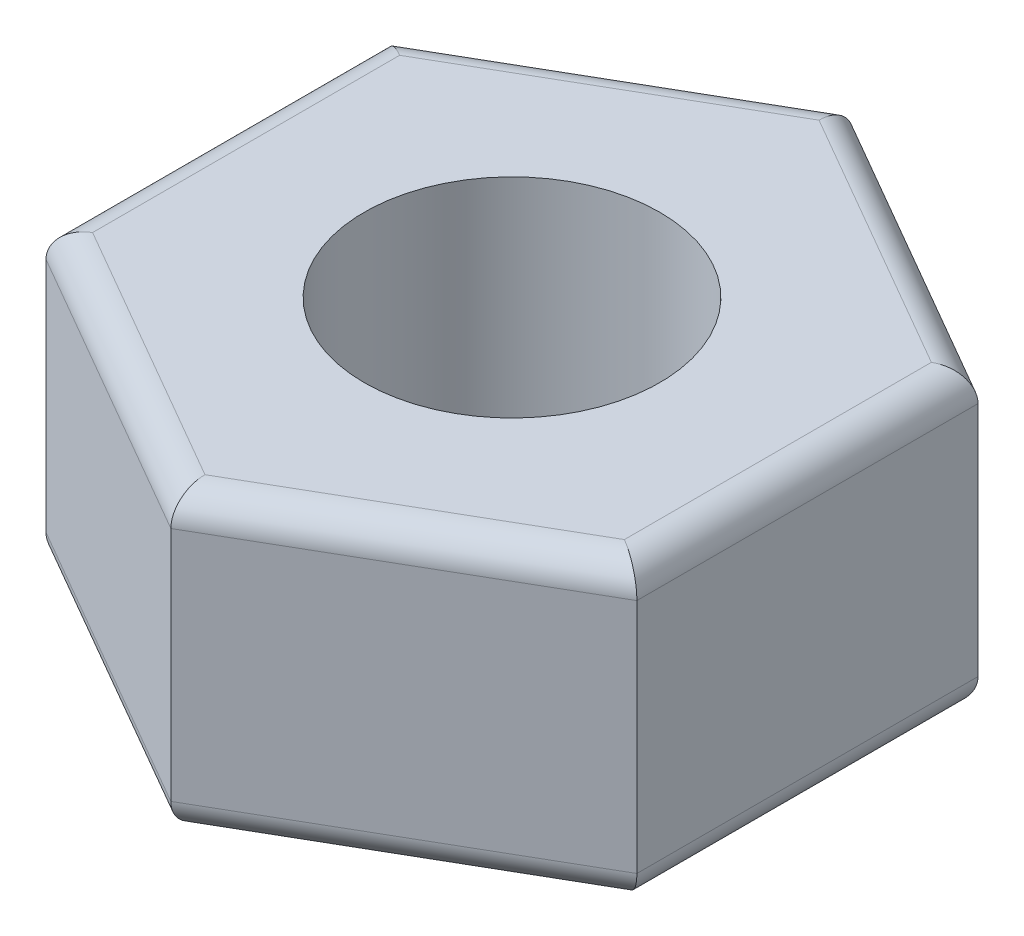
ISO-10303-21;
HEADER;
FILE_DESCRIPTION(('STEP AP214'),'2;1');
FILE_NAME('part.step','',(''),(''),'','','');
FILE_SCHEMA(('AUTOMOTIVE_DESIGN { 1 0 10303 214 1 1 1 1 }'));
ENDSEC;
DATA;
#1=APPLICATION_CONTEXT('core data for automotive mechanical design processes');
#2=APPLICATION_PROTOCOL_DEFINITION('international standard','automotive_design',2000,#1);
#3=PRODUCT_CONTEXT('',#1,'mechanical');
#4=PRODUCT('Part','Part','',(#3));
#5=PRODUCT_RELATED_PRODUCT_CATEGORY('part','',(#4));
#6=PRODUCT_DEFINITION_FORMATION('','',#4);
#7=PRODUCT_DEFINITION_CONTEXT('part definition',#1,'design');
#8=PRODUCT_DEFINITION('design','',#6,#7);
#9=PRODUCT_DEFINITION_SHAPE('','',#8);
#10=(LENGTH_UNIT() NAMED_UNIT(*) SI_UNIT(.MILLI.,.METRE.));
#11=(NAMED_UNIT(*) PLANE_ANGLE_UNIT() SI_UNIT($,.RADIAN.));
#12=(NAMED_UNIT(*) SI_UNIT($,.STERADIAN.) SOLID_ANGLE_UNIT());
#13=UNCERTAINTY_MEASURE_WITH_UNIT(LENGTH_MEASURE(1.E-05),#10,'distance_accuracy_value','');
#14=(GEOMETRIC_REPRESENTATION_CONTEXT(3) GLOBAL_UNCERTAINTY_ASSIGNED_CONTEXT((#13)) GLOBAL_UNIT_ASSIGNED_CONTEXT((#10,
#11,#12)) REPRESENTATION_CONTEXT('',''));
#15=CARTESIAN_POINT('',(0.,0.,0.));
#16=DIRECTION('',(0.,0.,1.));
#17=DIRECTION('',(1.,0.,0.));
#18=AXIS2_PLACEMENT_3D('',#15,#16,#17);
#19=CARTESIAN_POINT('',(0.,4.,0.));
#20=DIRECTION('',(0.,1.,0.));
#21=DIRECTION('',(0.,0.,1.));
#22=AXIS2_PLACEMENT_3D('',#19,#20,#21);
#23=PLANE('',#22);
#24=DIRECTION('',(-0.866025403784439,0.,0.5));
#25=VECTOR('',#24,1.);
#26=CARTESIAN_POINT('',(-3.8,4.,-1.96299091524473));
#27=LINE('',#26,#25);
#28=CARTESIAN_POINT('',(0.,4.,-4.15692193816531));
#29=VERTEX_POINT('',#28);
#30=CARTESIAN_POINT('',(-3.6,4.,-2.07846096908265));
#31=VERTEX_POINT('',#30);
#32=EDGE_CURVE('E54',#29,#31,#27,.T.);
#33=ORIENTED_EDGE('',*,*,#32,.T.);
#34=DIRECTION('',(0.,0.,1.));
#35=VECTOR('',#34,1.);
#36=CARTESIAN_POINT('',(-3.6,4.,2.3094010767585));
#37=LINE('',#36,#35);
#38=CARTESIAN_POINT('',(-3.6,4.,2.07846096908265));
#39=VERTEX_POINT('',#38);
#40=EDGE_CURVE('E11',#31,#39,#37,.T.);
#41=ORIENTED_EDGE('',*,*,#40,.T.);
#42=DIRECTION('',(0.866025403784439,0.,0.5));
#43=VECTOR('',#42,1.);
#44=CARTESIAN_POINT('',(0.200000000000001,4.,4.27239199200323));
#45=LINE('',#44,#43);
#46=CARTESIAN_POINT('',(0.,4.,4.1569219381653));
#47=VERTEX_POINT('',#46);
#48=EDGE_CURVE('E198',#39,#47,#45,.T.);
#49=ORIENTED_EDGE('',*,*,#48,.T.);
#50=DIRECTION('',(0.866025403784439,0.,-0.5));
#51=VECTOR('',#50,1.);
#52=CARTESIAN_POINT('',(3.8,4.,1.96299091524473));
#53=LINE('',#52,#51);
#54=CARTESIAN_POINT('',(3.6,4.,2.07846096908265));
#55=VERTEX_POINT('',#54);
#56=EDGE_CURVE('E196',#47,#55,#53,.T.);
#57=ORIENTED_EDGE('',*,*,#56,.T.);
#58=DIRECTION('',(0.,0.,-1.));
#59=VECTOR('',#58,1.);
#60=CARTESIAN_POINT('',(3.6,4.,-2.30940107675851));
#61=LINE('',#60,#59);
#62=CARTESIAN_POINT('',(3.6,4.,-2.07846096908266));
#63=VERTEX_POINT('',#62);
#64=EDGE_CURVE('E194',#55,#63,#61,.T.);
#65=ORIENTED_EDGE('',*,*,#64,.T.);
#66=DIRECTION('',(-0.866025403784439,0.,-0.5));
#67=VECTOR('',#66,1.);
#68=CARTESIAN_POINT('',(-0.200000000000002,4.,-4.27239199200323));
#69=LINE('',#68,#67);
#70=EDGE_CURVE('E65',#63,#29,#69,.T.);
#71=ORIENTED_EDGE('',*,*,#70,.T.);
#72=EDGE_LOOP('',(#33,#41,#49,#57,#65,#71));
#73=FACE_BOUND('',#72,.T.);
#74=CARTESIAN_POINT('',(0.,4.,0.));
#75=DIRECTION('',(0.,1.,0.));
#76=DIRECTION('',(0.,0.,1.));
#77=AXIS2_PLACEMENT_3D('',#74,#75,#76);
#78=CIRCLE('',#77,2.);
#79=CARTESIAN_POINT('',(0.,4.,2.));
#80=VERTEX_POINT('',#79);
#81=EDGE_CURVE('E242',#80,#80,#78,.T.);
#82=ORIENTED_EDGE('',*,*,#81,.F.);
#83=EDGE_LOOP('',(#82));
#84=FACE_BOUND('',#83,.T.);
#85=ADVANCED_FACE('F45',(#73,#84),#23,.T.);
#86=CARTESIAN_POINT('',(0.,0.,0.));
#87=DIRECTION('',(0.,1.,0.));
#88=DIRECTION('',(0.,0.,1.));
#89=AXIS2_PLACEMENT_3D('',#86,#87,#88);
#90=PLANE('',#89);
#91=DIRECTION('',(-0.866025403784439,0.,0.5));
#92=VECTOR('',#91,1.);
#93=CARTESIAN_POINT('',(-1.8,0.,-3.11769145362398));
#94=LINE('',#93,#92);
#95=CARTESIAN_POINT('',(-3.6,0.,-2.07846096908265));
#96=VERTEX_POINT('',#95);
#97=CARTESIAN_POINT('',(0.,0.,-4.15692193816531));
#98=VERTEX_POINT('',#97);
#99=EDGE_CURVE('E223',#96,#98,#94,.F.);
#100=ORIENTED_EDGE('',*,*,#99,.T.);
#101=DIRECTION('',(-0.866025403784439,0.,-0.5));
#102=VECTOR('',#101,1.);
#103=CARTESIAN_POINT('',(1.8,0.,-3.11769145362398));
#104=LINE('',#103,#102);
#105=CARTESIAN_POINT('',(3.6,0.,-2.07846096908266));
#106=VERTEX_POINT('',#105);
#107=EDGE_CURVE('E216',#98,#106,#104,.F.);
#108=ORIENTED_EDGE('',*,*,#107,.T.);
#109=DIRECTION('',(0.,0.,-1.));
#110=VECTOR('',#109,1.);
#111=CARTESIAN_POINT('',(3.6,0.,0.));
#112=LINE('',#111,#110);
#113=CARTESIAN_POINT('',(3.6,0.,2.07846096908265));
#114=VERTEX_POINT('',#113);
#115=EDGE_CURVE('E219',#106,#114,#112,.F.);
#116=ORIENTED_EDGE('',*,*,#115,.T.);
#117=DIRECTION('',(0.866025403784439,0.,-0.5));
#118=VECTOR('',#117,1.);
#119=CARTESIAN_POINT('',(1.8,0.,3.11769145362398));
#120=LINE('',#119,#118);
#121=CARTESIAN_POINT('',(0.,0.,4.15692193816531));
#122=VERTEX_POINT('',#121);
#123=EDGE_CURVE('E221',#114,#122,#120,.F.);
#124=ORIENTED_EDGE('',*,*,#123,.T.);
#125=DIRECTION('',(0.866025403784439,0.,0.5));
#126=VECTOR('',#125,1.);
#127=CARTESIAN_POINT('',(-1.8,0.,3.11769145362398));
#128=LINE('',#127,#126);
#129=CARTESIAN_POINT('',(-3.6,0.,2.07846096908265));
#130=VERTEX_POINT('',#129);
#131=EDGE_CURVE('E227',#122,#130,#128,.F.);
#132=ORIENTED_EDGE('',*,*,#131,.T.);
#133=DIRECTION('',(0.,0.,1.));
#134=VECTOR('',#133,1.);
#135=CARTESIAN_POINT('',(-3.6,0.,0.));
#136=LINE('',#135,#134);
#137=EDGE_CURVE('E225',#130,#96,#136,.F.);
#138=ORIENTED_EDGE('',*,*,#137,.T.);
#139=EDGE_LOOP('',(#100,#108,#116,#124,#132,#138));
#140=FACE_BOUND('',#139,.T.);
#141=CARTESIAN_POINT('',(0.,0.,0.));
#142=DIRECTION('',(0.,1.,0.));
#143=DIRECTION('',(0.,0.,1.));
#144=AXIS2_PLACEMENT_3D('',#141,#142,#143);
#145=CIRCLE('',#144,2.);
#146=CARTESIAN_POINT('',(0.,0.,2.));
#147=VERTEX_POINT('',#146);
#148=EDGE_CURVE('E178',#147,#147,#145,.T.);
#149=ORIENTED_EDGE('',*,*,#148,.T.);
#150=EDGE_LOOP('',(#149));
#151=FACE_BOUND('',#150,.T.);
#152=ADVANCED_FACE('F252',(#140,#151),#90,.F.);
#153=CARTESIAN_POINT('',(4.,4.,-2.30940107675851));
#154=DIRECTION('',(-0.5,0.,0.866025403784439));
#155=DIRECTION('',(0.866025403784439,0.,0.5));
#156=AXIS2_PLACEMENT_3D('',#153,#154,#155);
#157=PLANE('',#156);
#158=DIRECTION('',(0.,-1.,0.));
#159=VECTOR('',#158,1.);
#160=CARTESIAN_POINT('',(4.,4.,-2.30940107675851));
#161=LINE('',#160,#159);
#162=CARTESIAN_POINT('',(4.,3.6,-2.30940107675851));
#163=VERTEX_POINT('',#162);
#164=CARTESIAN_POINT('',(4.,0.4,-2.30940107675851));
#165=VERTEX_POINT('',#164);
#166=EDGE_CURVE('E240',#163,#165,#161,.T.);
#167=ORIENTED_EDGE('',*,*,#166,.T.);
#168=DIRECTION('',(-0.866025403784439,0.,-0.5));
#169=VECTOR('',#168,1.);
#170=CARTESIAN_POINT('',(4.,0.4,-2.30940107675851));
#171=LINE('',#170,#169);
#172=CARTESIAN_POINT('',(0.,0.4,-4.61880215351701));
#173=VERTEX_POINT('',#172);
#174=EDGE_CURVE('E155',#165,#173,#171,.T.);
#175=ORIENTED_EDGE('',*,*,#174,.T.);
#176=DIRECTION('',(0.,-1.,0.));
#177=VECTOR('',#176,1.);
#178=CARTESIAN_POINT('',(0.,4.,-4.61880215351701));
#179=LINE('',#178,#177);
#180=CARTESIAN_POINT('',(0.,3.6,-4.61880215351701));
#181=VERTEX_POINT('',#180);
#182=EDGE_CURVE('E138',#181,#173,#179,.T.);
#183=ORIENTED_EDGE('',*,*,#182,.F.);
#184=DIRECTION('',(-0.866025403784439,0.,-0.5));
#185=VECTOR('',#184,1.);
#186=CARTESIAN_POINT('',(4.,3.6,-2.30940107675851));
#187=LINE('',#186,#185);
#188=EDGE_CURVE('E152',#181,#163,#187,.F.);
#189=ORIENTED_EDGE('',*,*,#188,.T.);
#190=EDGE_LOOP('',(#167,#175,#183,#189));
#191=FACE_BOUND('',#190,.T.);
#192=ADVANCED_FACE('F151',(#191),#157,.F.);
#193=CARTESIAN_POINT('',(0.,4.,-4.61880215351701));
#194=DIRECTION('',(0.5,0.,0.866025403784438));
#195=DIRECTION('',(0.866025403784439,0.,-0.5));
#196=AXIS2_PLACEMENT_3D('',#193,#194,#195);
#197=PLANE('',#196);
#198=ORIENTED_EDGE('',*,*,#182,.T.);
#199=DIRECTION('',(-0.866025403784439,0.,0.5));
#200=VECTOR('',#199,1.);
#201=CARTESIAN_POINT('',(0.,0.4,-4.61880215351701));
#202=LINE('',#201,#200);
#203=CARTESIAN_POINT('',(-4.,0.4,-2.3094010767585));
#204=VERTEX_POINT('',#203);
#205=EDGE_CURVE('E144',#173,#204,#202,.T.);
#206=ORIENTED_EDGE('',*,*,#205,.T.);
#207=DIRECTION('',(0.,-1.,0.));
#208=VECTOR('',#207,1.);
#209=CARTESIAN_POINT('',(-4.,4.,-2.3094010767585));
#210=LINE('',#209,#208);
#211=CARTESIAN_POINT('',(-4.,3.6,-2.3094010767585));
#212=VERTEX_POINT('',#211);
#213=EDGE_CURVE('E140',#212,#204,#210,.T.);
#214=ORIENTED_EDGE('',*,*,#213,.F.);
#215=DIRECTION('',(-0.866025403784439,0.,0.5));
#216=VECTOR('',#215,1.);
#217=CARTESIAN_POINT('',(0.,3.6,-4.61880215351701));
#218=LINE('',#217,#216);
#219=EDGE_CURVE('E135',#212,#181,#218,.F.);
#220=ORIENTED_EDGE('',*,*,#219,.T.);
#221=EDGE_LOOP('',(#198,#206,#214,#220));
#222=FACE_BOUND('',#221,.T.);
#223=ADVANCED_FACE('F137',(#222),#197,.F.);
#224=CARTESIAN_POINT('',(-4.,4.,-2.3094010767585));
#225=DIRECTION('',(1.,0.,0.));
#226=DIRECTION('',(0.,0.,-1.));
#227=AXIS2_PLACEMENT_3D('',#224,#225,#226);
#228=PLANE('',#227);
#229=ORIENTED_EDGE('',*,*,#213,.T.);
#230=DIRECTION('',(0.,0.,1.));
#231=VECTOR('',#230,1.);
#232=CARTESIAN_POINT('',(-4.,0.4,-2.3094010767585));
#233=LINE('',#232,#231);
#234=CARTESIAN_POINT('',(-4.,0.4,2.3094010767585));
#235=VERTEX_POINT('',#234);
#236=EDGE_CURVE('E204',#204,#235,#233,.T.);
#237=ORIENTED_EDGE('',*,*,#236,.T.);
#238=DIRECTION('',(0.,-1.,0.));
#239=VECTOR('',#238,1.);
#240=CARTESIAN_POINT('',(-4.,4.,2.3094010767585));
#241=LINE('',#240,#239);
#242=CARTESIAN_POINT('',(-4.,3.6,2.3094010767585));
#243=VERTEX_POINT('',#242);
#244=EDGE_CURVE('E231',#243,#235,#241,.T.);
#245=ORIENTED_EDGE('',*,*,#244,.F.);
#246=DIRECTION('',(0.,0.,1.));
#247=VECTOR('',#246,1.);
#248=CARTESIAN_POINT('',(-4.,3.6,-2.3094010767585));
#249=LINE('',#248,#247);
#250=EDGE_CURVE('E206',#243,#212,#249,.F.);
#251=ORIENTED_EDGE('',*,*,#250,.T.);
#252=EDGE_LOOP('',(#229,#237,#245,#251));
#253=FACE_BOUND('',#252,.T.);
#254=ADVANCED_FACE('F272',(#253),#228,.F.);
#255=CARTESIAN_POINT('',(-4.,4.,2.3094010767585));
#256=DIRECTION('',(0.5,0.,-0.866025403784439));
#257=DIRECTION('',(-0.866025403784439,0.,-0.5));
#258=AXIS2_PLACEMENT_3D('',#255,#256,#257);
#259=PLANE('',#258);
#260=ORIENTED_EDGE('',*,*,#244,.T.);
#261=DIRECTION('',(0.866025403784439,0.,0.5));
#262=VECTOR('',#261,1.);
#263=CARTESIAN_POINT('',(-4.,0.4,2.3094010767585));
#264=LINE('',#263,#262);
#265=CARTESIAN_POINT('',(0.,0.4,4.61880215351701));
#266=VERTEX_POINT('',#265);
#267=EDGE_CURVE('E200',#235,#266,#264,.T.);
#268=ORIENTED_EDGE('',*,*,#267,.T.);
#269=DIRECTION('',(0.,-1.,0.));
#270=VECTOR('',#269,1.);
#271=CARTESIAN_POINT('',(0.,4.,4.61880215351701));
#272=LINE('',#271,#270);
#273=CARTESIAN_POINT('',(0.,3.6,4.61880215351701));
#274=VERTEX_POINT('',#273);
#275=EDGE_CURVE('E234',#274,#266,#272,.T.);
#276=ORIENTED_EDGE('',*,*,#275,.F.);
#277=DIRECTION('',(0.866025403784439,0.,0.5));
#278=VECTOR('',#277,1.);
#279=CARTESIAN_POINT('',(-4.,3.6,2.3094010767585));
#280=LINE('',#279,#278);
#281=EDGE_CURVE('E202',#274,#243,#280,.F.);
#282=ORIENTED_EDGE('',*,*,#281,.T.);
#283=EDGE_LOOP('',(#260,#268,#276,#282));
#284=FACE_BOUND('',#283,.T.);
#285=ADVANCED_FACE('F268',(#284),#259,.F.);
#286=CARTESIAN_POINT('',(0.,4.,4.61880215351701));
#287=DIRECTION('',(-0.5,0.,-0.866025403784439));
#288=DIRECTION('',(-0.866025403784439,0.,0.5));
#289=AXIS2_PLACEMENT_3D('',#286,#287,#288);
#290=PLANE('',#289);
#291=ORIENTED_EDGE('',*,*,#275,.T.);
#292=DIRECTION('',(0.866025403784439,0.,-0.5));
#293=VECTOR('',#292,1.);
#294=CARTESIAN_POINT('',(0.,0.4,4.61880215351701));
#295=LINE('',#294,#293);
#296=CARTESIAN_POINT('',(4.,0.4,2.3094010767585));
#297=VERTEX_POINT('',#296);
#298=EDGE_CURVE('E145',#266,#297,#295,.T.);
#299=ORIENTED_EDGE('',*,*,#298,.T.);
#300=DIRECTION('',(0.,-1.,0.));
#301=VECTOR('',#300,1.);
#302=CARTESIAN_POINT('',(4.,4.,2.3094010767585));
#303=LINE('',#302,#301);
#304=CARTESIAN_POINT('',(4.,3.6,2.3094010767585));
#305=VERTEX_POINT('',#304);
#306=EDGE_CURVE('E237',#305,#297,#303,.T.);
#307=ORIENTED_EDGE('',*,*,#306,.F.);
#308=DIRECTION('',(0.866025403784439,0.,-0.5));
#309=VECTOR('',#308,1.);
#310=CARTESIAN_POINT('',(0.,3.6,4.61880215351701));
#311=LINE('',#310,#309);
#312=EDGE_CURVE('E210',#305,#274,#311,.F.);
#313=ORIENTED_EDGE('',*,*,#312,.T.);
#314=EDGE_LOOP('',(#291,#299,#307,#313));
#315=FACE_BOUND('',#314,.T.);
#316=ADVANCED_FACE('F264',(#315),#290,.F.);
#317=CARTESIAN_POINT('',(4.,4.,2.3094010767585));
#318=DIRECTION('',(-1.,0.,0.));
#319=DIRECTION('',(0.,0.,1.));
#320=AXIS2_PLACEMENT_3D('',#317,#318,#319);
#321=PLANE('',#320);
#322=ORIENTED_EDGE('',*,*,#306,.T.);
#323=DIRECTION('',(0.,0.,-1.));
#324=VECTOR('',#323,1.);
#325=CARTESIAN_POINT('',(4.,0.4,2.3094010767585));
#326=LINE('',#325,#324);
#327=EDGE_CURVE('E212',#297,#165,#326,.T.);
#328=ORIENTED_EDGE('',*,*,#327,.T.);
#329=ORIENTED_EDGE('',*,*,#166,.F.);
#330=DIRECTION('',(0.,0.,-1.));
#331=VECTOR('',#330,1.);
#332=CARTESIAN_POINT('',(4.,3.6,2.3094010767585));
#333=LINE('',#332,#331);
#334=EDGE_CURVE('E214',#163,#305,#333,.F.);
#335=ORIENTED_EDGE('',*,*,#334,.T.);
#336=EDGE_LOOP('',(#322,#328,#329,#335));
#337=FACE_BOUND('',#336,.T.);
#338=ADVANCED_FACE('F261',(#337),#321,.F.);
#339=CARTESIAN_POINT('',(0.,4.,0.));
#340=DIRECTION('',(0.,-1.,0.));
#341=DIRECTION('',(0.,0.,-1.));
#342=AXIS2_PLACEMENT_3D('',#339,#340,#341);
#343=CYLINDRICAL_SURFACE('',#342,2.);
#344=ORIENTED_EDGE('',*,*,#81,.T.);
#345=EDGE_LOOP('',(#344));
#346=FACE_BOUND('',#345,.T.);
#347=ORIENTED_EDGE('',*,*,#148,.F.);
#348=EDGE_LOOP('',(#347));
#349=FACE_BOUND('',#348,.T.);
#350=ADVANCED_FACE('F248',(#346,#349),#343,.F.);
#351=CARTESIAN_POINT('',(-3.8,0.4,1.96299091524473));
#352=DIRECTION('',(0.866025403784439,0.,0.5));
#353=DIRECTION('',(0.5,0.,-0.866025403784439));
#354=AXIS2_PLACEMENT_3D('',#351,#352,#353);
#355=CYLINDRICAL_SURFACE('',#354,0.4);
#356=CARTESIAN_POINT('',(-3.6,0.4,2.07846096908265));
#357=DIRECTION('',(0.5,0.,0.866025403784438));
#358=DIRECTION('',(0.866025403784439,0.,-0.5));
#359=AXIS2_PLACEMENT_3D('',#356,#357,#358);
#360=ELLIPSE('',#359,0.461880215351701,0.4);
#361=EDGE_CURVE('E179',#130,#235,#360,.F.);
#362=ORIENTED_EDGE('',*,*,#361,.F.);
#363=ORIENTED_EDGE('',*,*,#131,.F.);
#364=CARTESIAN_POINT('',(0.,0.4,4.15692193816531));
#365=DIRECTION('',(1.,0.,0.));
#366=DIRECTION('',(0.,0.,1.));
#367=AXIS2_PLACEMENT_3D('',#364,#365,#366);
#368=ELLIPSE('',#367,0.461880215351701,0.4);
#369=EDGE_CURVE('E175',#266,#122,#368,.T.);
#370=ORIENTED_EDGE('',*,*,#369,.F.);
#371=ORIENTED_EDGE('',*,*,#267,.F.);
#372=EDGE_LOOP('',(#362,#363,#370,#371));
#373=FACE_BOUND('',#372,.T.);
#374=ADVANCED_FACE('F300',(#373),#355,.T.);
#375=CARTESIAN_POINT('',(-0.2,0.4,4.27239199200323));
#376=DIRECTION('',(0.866025403784439,0.,-0.5));
#377=DIRECTION('',(-0.5,0.,-0.866025403784439));
#378=AXIS2_PLACEMENT_3D('',#375,#376,#377);
#379=CYLINDRICAL_SURFACE('',#378,0.4);
#380=ORIENTED_EDGE('',*,*,#369,.T.);
#381=ORIENTED_EDGE('',*,*,#123,.F.);
#382=CARTESIAN_POINT('',(3.6,0.4,2.07846096908265));
#383=DIRECTION('',(0.5,0.,-0.866025403784439));
#384=DIRECTION('',(0.866025403784439,0.,0.5));
#385=AXIS2_PLACEMENT_3D('',#382,#383,#384);
#386=ELLIPSE('',#385,0.461880215351701,0.4);
#387=EDGE_CURVE('E182',#297,#114,#386,.T.);
#388=ORIENTED_EDGE('',*,*,#387,.F.);
#389=ORIENTED_EDGE('',*,*,#298,.F.);
#390=EDGE_LOOP('',(#380,#381,#388,#389));
#391=FACE_BOUND('',#390,.T.);
#392=ADVANCED_FACE('F296',(#391),#379,.T.);
#393=CARTESIAN_POINT('',(-3.6,0.4,-2.3094010767585));
#394=DIRECTION('',(0.,0.,1.));
#395=DIRECTION('',(1.,0.,0.));
#396=AXIS2_PLACEMENT_3D('',#393,#394,#395);
#397=CYLINDRICAL_SURFACE('',#396,0.4);
#398=ORIENTED_EDGE('',*,*,#361,.T.);
#399=ORIENTED_EDGE('',*,*,#236,.F.);
#400=CARTESIAN_POINT('',(-3.6,0.4,-2.07846096908265));
#401=DIRECTION('',(-0.5,0.,0.866025403784439));
#402=DIRECTION('',(0.866025403784439,0.,0.5));
#403=AXIS2_PLACEMENT_3D('',#400,#401,#402);
#404=ELLIPSE('',#403,0.461880215351701,0.4);
#405=EDGE_CURVE('E185',#96,#204,#404,.F.);
#406=ORIENTED_EDGE('',*,*,#405,.F.);
#407=ORIENTED_EDGE('',*,*,#137,.F.);
#408=EDGE_LOOP('',(#398,#399,#406,#407));
#409=FACE_BOUND('',#408,.T.);
#410=ADVANCED_FACE('F292',(#409),#397,.T.);
#411=CARTESIAN_POINT('',(3.6,0.4,2.3094010767585));
#412=DIRECTION('',(0.,0.,-1.));
#413=DIRECTION('',(-1.,0.,0.));
#414=AXIS2_PLACEMENT_3D('',#411,#412,#413);
#415=CYLINDRICAL_SURFACE('',#414,0.4);
#416=ORIENTED_EDGE('',*,*,#387,.T.);
#417=ORIENTED_EDGE('',*,*,#115,.F.);
#418=CARTESIAN_POINT('',(3.6,0.4,-2.07846096908266));
#419=DIRECTION('',(-0.5,0.,-0.866025403784438));
#420=DIRECTION('',(0.866025403784439,0.,-0.5));
#421=AXIS2_PLACEMENT_3D('',#418,#419,#420);
#422=ELLIPSE('',#421,0.461880215351701,0.4);
#423=EDGE_CURVE('E188',#165,#106,#422,.T.);
#424=ORIENTED_EDGE('',*,*,#423,.F.);
#425=ORIENTED_EDGE('',*,*,#327,.F.);
#426=EDGE_LOOP('',(#416,#417,#424,#425));
#427=FACE_BOUND('',#426,.T.);
#428=ADVANCED_FACE('F288',(#427),#415,.T.);
#429=CARTESIAN_POINT('',(0.199999999999998,0.4,-4.27239199200323));
#430=DIRECTION('',(-0.866025403784439,0.,0.5));
#431=DIRECTION('',(0.5,0.,0.866025403784438));
#432=AXIS2_PLACEMENT_3D('',#429,#430,#431);
#433=CYLINDRICAL_SURFACE('',#432,0.4);
#434=ORIENTED_EDGE('',*,*,#405,.T.);
#435=ORIENTED_EDGE('',*,*,#205,.F.);
#436=CARTESIAN_POINT('',(0.,0.4,-4.15692193816531));
#437=DIRECTION('',(-1.,0.,0.));
#438=DIRECTION('',(0.,0.,1.));
#439=AXIS2_PLACEMENT_3D('',#436,#437,#438);
#440=ELLIPSE('',#439,0.461880215351701,0.4);
#441=EDGE_CURVE('E190',#98,#173,#440,.F.);
#442=ORIENTED_EDGE('',*,*,#441,.F.);
#443=ORIENTED_EDGE('',*,*,#99,.F.);
#444=EDGE_LOOP('',(#434,#435,#442,#443));
#445=FACE_BOUND('',#444,.T.);
#446=ADVANCED_FACE('F284',(#445),#433,.T.);
#447=CARTESIAN_POINT('',(3.8,0.4,-1.96299091524473));
#448=DIRECTION('',(-0.866025403784439,0.,-0.5));
#449=DIRECTION('',(-0.5,0.,0.866025403784439));
#450=AXIS2_PLACEMENT_3D('',#447,#448,#449);
#451=CYLINDRICAL_SURFACE('',#450,0.4);
#452=ORIENTED_EDGE('',*,*,#423,.T.);
#453=ORIENTED_EDGE('',*,*,#107,.F.);
#454=ORIENTED_EDGE('',*,*,#441,.T.);
#455=ORIENTED_EDGE('',*,*,#174,.F.);
#456=EDGE_LOOP('',(#452,#453,#454,#455));
#457=FACE_BOUND('',#456,.T.);
#458=ADVANCED_FACE('F281',(#457),#451,.T.);
#459=CARTESIAN_POINT('',(3.6,3.6,0.));
#460=DIRECTION('',(0.,0.,1.));
#461=DIRECTION('',(1.,0.,0.));
#462=AXIS2_PLACEMENT_3D('',#459,#460,#461);
#463=CYLINDRICAL_SURFACE('',#462,0.4);
#464=CARTESIAN_POINT('',(3.6,3.6,2.07846096908265));
#465=DIRECTION('',(-0.5,0.,0.866025403784439));
#466=DIRECTION('',(-0.866025403784439,0.,-0.5));
#467=AXIS2_PLACEMENT_3D('',#464,#465,#466);
#468=ELLIPSE('',#467,0.461880215351701,0.4);
#469=EDGE_CURVE('E164',#305,#55,#468,.T.);
#470=ORIENTED_EDGE('',*,*,#469,.F.);
#471=ORIENTED_EDGE('',*,*,#334,.F.);
#472=CARTESIAN_POINT('',(3.6,3.6,-2.07846096908266));
#473=DIRECTION('',(0.5,0.,0.866025403784438));
#474=DIRECTION('',(-0.866025403784439,0.,0.5));
#475=AXIS2_PLACEMENT_3D('',#472,#473,#474);
#476=ELLIPSE('',#475,0.461880215351701,0.4);
#477=EDGE_CURVE('E49',#63,#163,#476,.F.);
#478=ORIENTED_EDGE('',*,*,#477,.F.);
#479=ORIENTED_EDGE('',*,*,#64,.F.);
#480=EDGE_LOOP('',(#470,#471,#478,#479));
#481=FACE_BOUND('',#480,.T.);
#482=ADVANCED_FACE('F47',(#481),#463,.T.);
#483=CARTESIAN_POINT('',(1.8,3.6,-3.11769145362398));
#484=DIRECTION('',(0.866025403784439,0.,0.5));
#485=DIRECTION('',(0.5,0.,-0.866025403784439));
#486=AXIS2_PLACEMENT_3D('',#483,#484,#485);
#487=CYLINDRICAL_SURFACE('',#486,0.4);
#488=ORIENTED_EDGE('',*,*,#477,.T.);
#489=ORIENTED_EDGE('',*,*,#188,.F.);
#490=CARTESIAN_POINT('',(0.,3.6,-4.15692193816531));
#491=DIRECTION('',(1.,0.,0.));
#492=DIRECTION('',(0.,0.,1.));
#493=AXIS2_PLACEMENT_3D('',#490,#491,#492);
#494=ELLIPSE('',#493,0.461880215351701,0.4);
#495=EDGE_CURVE('E160',#29,#181,#494,.F.);
#496=ORIENTED_EDGE('',*,*,#495,.F.);
#497=ORIENTED_EDGE('',*,*,#70,.F.);
#498=EDGE_LOOP('',(#488,#489,#496,#497));
#499=FACE_BOUND('',#498,.T.);
#500=ADVANCED_FACE('F159',(#499),#487,.T.);
#501=CARTESIAN_POINT('',(1.8,3.6,3.11769145362398));
#502=DIRECTION('',(-0.866025403784439,0.,0.5));
#503=DIRECTION('',(0.5,0.,0.866025403784439));
#504=AXIS2_PLACEMENT_3D('',#501,#502,#503);
#505=CYLINDRICAL_SURFACE('',#504,0.4);
#506=ORIENTED_EDGE('',*,*,#469,.T.);
#507=ORIENTED_EDGE('',*,*,#56,.F.);
#508=CARTESIAN_POINT('',(0.,3.6,4.15692193816531));
#509=DIRECTION('',(-1.,0.,0.));
#510=DIRECTION('',(0.,0.,-1.));
#511=AXIS2_PLACEMENT_3D('',#508,#509,#510);
#512=ELLIPSE('',#511,0.461880215351701,0.4);
#513=EDGE_CURVE('E165',#274,#47,#512,.T.);
#514=ORIENTED_EDGE('',*,*,#513,.F.);
#515=ORIENTED_EDGE('',*,*,#312,.F.);
#516=EDGE_LOOP('',(#506,#507,#514,#515));
#517=FACE_BOUND('',#516,.T.);
#518=ADVANCED_FACE('F315',(#517),#505,.T.);
#519=CARTESIAN_POINT('',(-1.8,3.6,-3.11769145362398));
#520=DIRECTION('',(0.866025403784439,0.,-0.5));
#521=DIRECTION('',(-0.5,0.,-0.866025403784438));
#522=AXIS2_PLACEMENT_3D('',#519,#520,#521);
#523=CYLINDRICAL_SURFACE('',#522,0.4);
#524=ORIENTED_EDGE('',*,*,#495,.T.);
#525=ORIENTED_EDGE('',*,*,#219,.F.);
#526=CARTESIAN_POINT('',(-3.6,3.6,-2.07846096908265));
#527=DIRECTION('',(0.5,0.,-0.866025403784439));
#528=DIRECTION('',(0.866025403784439,0.,0.5));
#529=AXIS2_PLACEMENT_3D('',#526,#527,#528);
#530=ELLIPSE('',#529,0.461880215351701,0.4);
#531=EDGE_CURVE('E169',#31,#212,#530,.F.);
#532=ORIENTED_EDGE('',*,*,#531,.F.);
#533=ORIENTED_EDGE('',*,*,#32,.F.);
#534=EDGE_LOOP('',(#524,#525,#532,#533));
#535=FACE_BOUND('',#534,.T.);
#536=ADVANCED_FACE('F163',(#535),#523,.T.);
#537=CARTESIAN_POINT('',(-1.8,3.6,3.11769145362398));
#538=DIRECTION('',(-0.866025403784439,0.,-0.5));
#539=DIRECTION('',(-0.5,0.,0.866025403784439));
#540=AXIS2_PLACEMENT_3D('',#537,#538,#539);
#541=CYLINDRICAL_SURFACE('',#540,0.4);
#542=ORIENTED_EDGE('',*,*,#513,.T.);
#543=ORIENTED_EDGE('',*,*,#48,.F.);
#544=CARTESIAN_POINT('',(-3.6,3.6,2.07846096908265));
#545=DIRECTION('',(-0.5,0.,-0.866025403784438));
#546=DIRECTION('',(-0.866025403784439,0.,0.5));
#547=AXIS2_PLACEMENT_3D('',#544,#545,#546);
#548=ELLIPSE('',#547,0.461880215351701,0.4);
#549=EDGE_CURVE('E173',#243,#39,#548,.T.);
#550=ORIENTED_EDGE('',*,*,#549,.F.);
#551=ORIENTED_EDGE('',*,*,#281,.F.);
#552=EDGE_LOOP('',(#542,#543,#550,#551));
#553=FACE_BOUND('',#552,.T.);
#554=ADVANCED_FACE('F308',(#553),#541,.T.);
#555=CARTESIAN_POINT('',(-3.6,3.6,0.));
#556=DIRECTION('',(0.,0.,-1.));
#557=DIRECTION('',(-1.,0.,0.));
#558=AXIS2_PLACEMENT_3D('',#555,#556,#557);
#559=CYLINDRICAL_SURFACE('',#558,0.4);
#560=ORIENTED_EDGE('',*,*,#531,.T.);
#561=ORIENTED_EDGE('',*,*,#250,.F.);
#562=ORIENTED_EDGE('',*,*,#549,.T.);
#563=ORIENTED_EDGE('',*,*,#40,.F.);
#564=EDGE_LOOP('',(#560,#561,#562,#563));
#565=FACE_BOUND('',#564,.T.);
#566=ADVANCED_FACE('F305',(#565),#559,.T.);
#567=CLOSED_SHELL('',(#85,#152,#192,#223,#254,#285,#316,#338,#350,#374,#392,#410,#428,#446,#458,
#482,#500,#518,#536,#554,#566));
#568=MANIFOLD_SOLID_BREP('B2',#567);
#569=ADVANCED_BREP_SHAPE_REPRESENTATION('',(#18,#568),#14);
#570=SHAPE_DEFINITION_REPRESENTATION(#9,#569);
ENDSEC;
END-ISO-10303-21;
